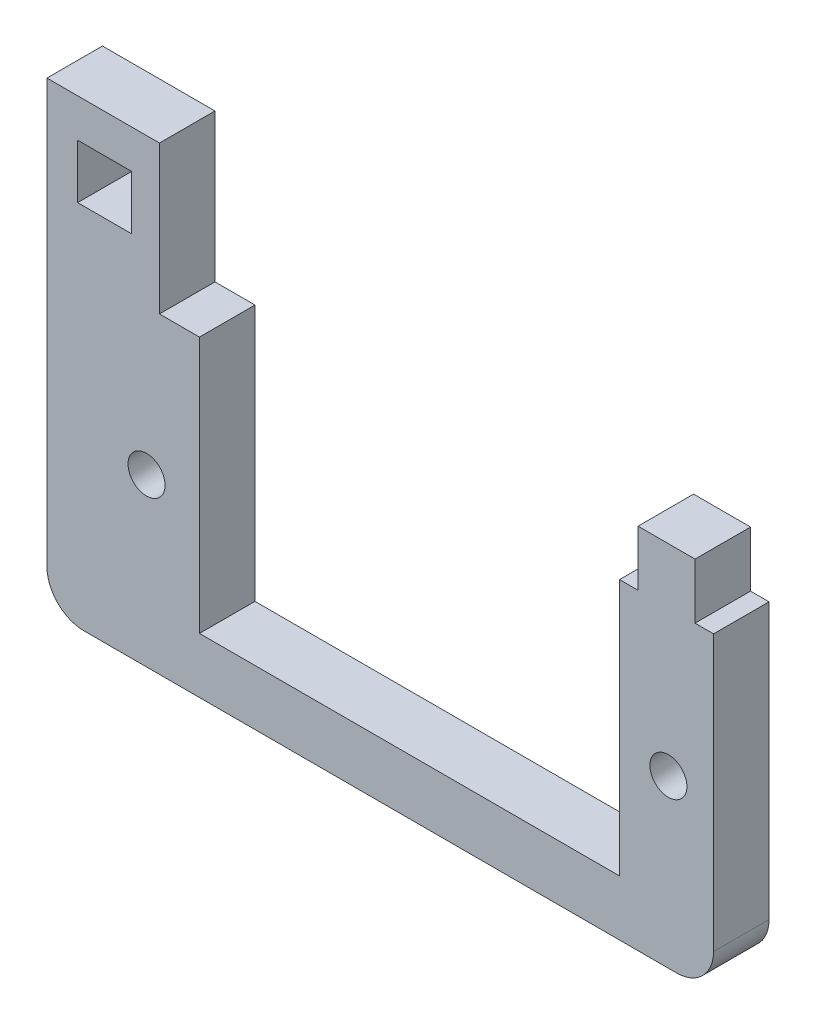
ISO-10303-21;
HEADER;
FILE_DESCRIPTION(('STEP AP214'),'2;1');
FILE_NAME('part.step','',(''),(''),'','','');
FILE_SCHEMA(('AUTOMOTIVE_DESIGN { 1 0 10303 214 1 1 1 1 }'));
ENDSEC;
DATA;
#1=APPLICATION_CONTEXT('core data for automotive mechanical design processes');
#2=APPLICATION_PROTOCOL_DEFINITION('international standard','automotive_design',2000,#1);
#3=PRODUCT_CONTEXT('',#1,'mechanical');
#4=PRODUCT('Part','Part','',(#3));
#5=PRODUCT_RELATED_PRODUCT_CATEGORY('part','',(#4));
#6=PRODUCT_DEFINITION_FORMATION('','',#4);
#7=PRODUCT_DEFINITION_CONTEXT('part definition',#1,'design');
#8=PRODUCT_DEFINITION('design','',#6,#7);
#9=PRODUCT_DEFINITION_SHAPE('','',#8);
#10=(LENGTH_UNIT() NAMED_UNIT(*) SI_UNIT(.MILLI.,.METRE.));
#11=(NAMED_UNIT(*) PLANE_ANGLE_UNIT() SI_UNIT($,.RADIAN.));
#12=(NAMED_UNIT(*) SI_UNIT($,.STERADIAN.) SOLID_ANGLE_UNIT());
#13=UNCERTAINTY_MEASURE_WITH_UNIT(LENGTH_MEASURE(1.E-05),#10,'distance_accuracy_value','');
#14=(GEOMETRIC_REPRESENTATION_CONTEXT(3) GLOBAL_UNCERTAINTY_ASSIGNED_CONTEXT((#13)) GLOBAL_UNIT_ASSIGNED_CONTEXT((#10,
#11,#12)) REPRESENTATION_CONTEXT('',''));
#15=CARTESIAN_POINT('',(0.,0.,0.));
#16=DIRECTION('',(0.,0.,1.));
#17=DIRECTION('',(1.,0.,0.));
#18=AXIS2_PLACEMENT_3D('',#15,#16,#17);
#19=CARTESIAN_POINT('',(0.,0.,3.));
#20=DIRECTION('',(0.,0.,-1.));
#21=DIRECTION('',(-1.,0.,0.));
#22=AXIS2_PLACEMENT_3D('',#19,#20,#21);
#23=PLANE('',#22);
#24=CARTESIAN_POINT('',(25.7454054054054,-2.51864864864865,3.));
#25=DIRECTION('',(0.,0.,1.));
#26=DIRECTION('',(1.,0.,0.));
#27=AXIS2_PLACEMENT_3D('',#24,#25,#26);
#28=CIRCLE('',#27,1.);
#29=CARTESIAN_POINT('',(26.7454054054054,-2.51864864864865,3.));
#30=VERTEX_POINT('',#29);
#31=EDGE_CURVE('E215',#30,#30,#28,.T.);
#32=ORIENTED_EDGE('',*,*,#31,.F.);
#33=EDGE_LOOP('',(#32));
#34=FACE_BOUND('',#33,.T.);
#35=CARTESIAN_POINT('',(-2.4545945945946,-2.51864864864865,3.));
#36=DIRECTION('',(0.,0.,1.));
#37=DIRECTION('',(1.,0.,0.));
#38=AXIS2_PLACEMENT_3D('',#35,#36,#37);
#39=CIRCLE('',#38,1.);
#40=CARTESIAN_POINT('',(-1.4545945945946,-2.51864864864865,3.));
#41=VERTEX_POINT('',#40);
#42=EDGE_CURVE('E221',#41,#41,#39,.T.);
#43=ORIENTED_EDGE('',*,*,#42,.F.);
#44=EDGE_LOOP('',(#43));
#45=FACE_BOUND('',#44,.T.);
#46=DIRECTION('',(0.,-1.,0.));
#47=VECTOR('',#46,1.);
#48=CARTESIAN_POINT('',(-7.83675675675677,-11.5186486486487,3.));
#49=LINE('',#48,#47);
#50=CARTESIAN_POINT('',(-7.83675675675677,13.3513513513513,3.));
#51=VERTEX_POINT('',#50);
#52=CARTESIAN_POINT('',(-7.83675675675677,-9.51864864864866,3.));
#53=VERTEX_POINT('',#52);
#54=EDGE_CURVE('E227',#51,#53,#49,.T.);
#55=ORIENTED_EDGE('',*,*,#54,.T.);
#56=CARTESIAN_POINT('',(-5.83675675675677,-9.51864864864866,3.));
#57=DIRECTION('',(0.,0.,-1.));
#58=DIRECTION('',(-1.,0.,0.));
#59=AXIS2_PLACEMENT_3D('',#56,#57,#58);
#60=CIRCLE('',#59,2.);
#61=CARTESIAN_POINT('',(-5.83675675675677,-11.5186486486487,3.));
#62=VERTEX_POINT('',#61);
#63=EDGE_CURVE('E41',#53,#62,#60,.F.);
#64=ORIENTED_EDGE('',*,*,#63,.T.);
#65=DIRECTION('',(1.,0.,0.));
#66=VECTOR('',#65,1.);
#67=CARTESIAN_POINT('',(28.1854054054054,-11.5186486486487,3.));
#68=LINE('',#67,#66);
#69=CARTESIAN_POINT('',(26.1854054054054,-11.5186486486487,3.));
#70=VERTEX_POINT('',#69);
#71=EDGE_CURVE('E229',#62,#70,#68,.T.);
#72=ORIENTED_EDGE('',*,*,#71,.T.);
#73=CARTESIAN_POINT('',(26.1854054054054,-9.51864864864865,3.));
#74=DIRECTION('',(0.,0.,-1.));
#75=DIRECTION('',(-1.,0.,0.));
#76=AXIS2_PLACEMENT_3D('',#73,#74,#75);
#77=CIRCLE('',#76,2.);
#78=CARTESIAN_POINT('',(28.1854054054054,-9.51864864864865,3.));
#79=VERTEX_POINT('',#78);
#80=EDGE_CURVE('E48',#70,#79,#77,.F.);
#81=ORIENTED_EDGE('',*,*,#80,.T.);
#82=DIRECTION('',(0.,1.,0.));
#83=VECTOR('',#82,1.);
#84=CARTESIAN_POINT('',(28.1854054054054,5.35135135135135,3.));
#85=LINE('',#84,#83);
#86=CARTESIAN_POINT('',(28.1854054054054,5.35135135135135,3.));
#87=VERTEX_POINT('',#86);
#88=EDGE_CURVE('E232',#79,#87,#85,.T.);
#89=ORIENTED_EDGE('',*,*,#88,.T.);
#90=DIRECTION('',(-1.,0.,0.));
#91=VECTOR('',#90,1.);
#92=CARTESIAN_POINT('',(27.1854054054054,5.35135135135135,3.));
#93=LINE('',#92,#91);
#94=CARTESIAN_POINT('',(27.1854054054054,5.35135135135135,3.));
#95=VERTEX_POINT('',#94);
#96=EDGE_CURVE('E234',#87,#95,#93,.T.);
#97=ORIENTED_EDGE('',*,*,#96,.T.);
#98=DIRECTION('',(0.,1.,0.));
#99=VECTOR('',#98,1.);
#100=CARTESIAN_POINT('',(27.1854054054054,8.35135135135135,3.));
#101=LINE('',#100,#99);
#102=CARTESIAN_POINT('',(27.1854054054054,8.35135135135135,3.));
#103=VERTEX_POINT('',#102);
#104=EDGE_CURVE('E236',#95,#103,#101,.T.);
#105=ORIENTED_EDGE('',*,*,#104,.T.);
#106=DIRECTION('',(-1.,0.,0.));
#107=VECTOR('',#106,1.);
#108=CARTESIAN_POINT('',(24.1054054054054,8.35135135135135,3.));
#109=LINE('',#108,#107);
#110=CARTESIAN_POINT('',(24.1054054054054,8.35135135135135,3.));
#111=VERTEX_POINT('',#110);
#112=EDGE_CURVE('E238',#103,#111,#109,.T.);
#113=ORIENTED_EDGE('',*,*,#112,.T.);
#114=DIRECTION('',(0.,-1.,0.));
#115=VECTOR('',#114,1.);
#116=CARTESIAN_POINT('',(24.1054054054054,5.35135135135135,3.));
#117=LINE('',#116,#115);
#118=CARTESIAN_POINT('',(24.1054054054054,5.35135135135135,3.));
#119=VERTEX_POINT('',#118);
#120=EDGE_CURVE('E240',#111,#119,#117,.T.);
#121=ORIENTED_EDGE('',*,*,#120,.T.);
#122=DIRECTION('',(-1.,0.,0.));
#123=VECTOR('',#122,1.);
#124=CARTESIAN_POINT('',(23.1054054054054,5.35135135135135,3.));
#125=LINE('',#124,#123);
#126=CARTESIAN_POINT('',(23.1054054054054,5.35135135135135,3.));
#127=VERTEX_POINT('',#126);
#128=EDGE_CURVE('E242',#119,#127,#125,.T.);
#129=ORIENTED_EDGE('',*,*,#128,.T.);
#130=DIRECTION('',(0.,-1.,0.));
#131=VECTOR('',#130,1.);
#132=CARTESIAN_POINT('',(23.1054054054054,-8.51864864864865,3.));
#133=LINE('',#132,#131);
#134=CARTESIAN_POINT('',(23.1054054054054,-8.51864864864865,3.));
#135=VERTEX_POINT('',#134);
#136=EDGE_CURVE('E244',#127,#135,#133,.T.);
#137=ORIENTED_EDGE('',*,*,#136,.T.);
#138=DIRECTION('',(-1.,0.,0.));
#139=VECTOR('',#138,1.);
#140=CARTESIAN_POINT('',(0.405405405405402,-8.51864864864865,3.));
#141=LINE('',#140,#139);
#142=CARTESIAN_POINT('',(0.405405405405402,-8.51864864864865,3.));
#143=VERTEX_POINT('',#142);
#144=EDGE_CURVE('E246',#135,#143,#141,.T.);
#145=ORIENTED_EDGE('',*,*,#144,.T.);
#146=DIRECTION('',(0.,1.,0.));
#147=VECTOR('',#146,1.);
#148=CARTESIAN_POINT('',(0.4054054054054,5.35135135135135,3.));
#149=LINE('',#148,#147);
#150=CARTESIAN_POINT('',(0.4054054054054,5.35135135135135,3.));
#151=VERTEX_POINT('',#150);
#152=EDGE_CURVE('E248',#143,#151,#149,.T.);
#153=ORIENTED_EDGE('',*,*,#152,.T.);
#154=DIRECTION('',(-1.,0.,0.));
#155=VECTOR('',#154,1.);
#156=CARTESIAN_POINT('',(-1.75675675675676,5.35135135135135,3.));
#157=LINE('',#156,#155);
#158=CARTESIAN_POINT('',(-1.75675675675676,5.35135135135135,3.));
#159=VERTEX_POINT('',#158);
#160=EDGE_CURVE('E250',#151,#159,#157,.T.);
#161=ORIENTED_EDGE('',*,*,#160,.T.);
#162=DIRECTION('',(0.,1.,0.));
#163=VECTOR('',#162,1.);
#164=CARTESIAN_POINT('',(-1.75675675675677,13.3513513513513,3.));
#165=LINE('',#164,#163);
#166=CARTESIAN_POINT('',(-1.75675675675677,13.3513513513513,3.));
#167=VERTEX_POINT('',#166);
#168=EDGE_CURVE('E252',#159,#167,#165,.T.);
#169=ORIENTED_EDGE('',*,*,#168,.T.);
#170=DIRECTION('',(-1.,0.,0.));
#171=VECTOR('',#170,1.);
#172=CARTESIAN_POINT('',(-7.83675675675677,13.3513513513513,3.));
#173=LINE('',#172,#171);
#174=EDGE_CURVE('E254',#167,#51,#173,.T.);
#175=ORIENTED_EDGE('',*,*,#174,.T.);
#176=EDGE_LOOP('',(#55,#64,#72,#81,#89,#97,#105,#113,#121,#129,#137,#145,#153,#161,#169,#175));
#177=FACE_BOUND('',#176,.T.);
#178=DIRECTION('',(0.,-1.,0.));
#179=VECTOR('',#178,1.);
#180=CARTESIAN_POINT('',(-6.17675675675677,11.2713513513513,3.));
#181=LINE('',#180,#179);
#182=CARTESIAN_POINT('',(-6.17675675675677,11.2713513513513,3.));
#183=VERTEX_POINT('',#182);
#184=CARTESIAN_POINT('',(-6.17675675675677,8.35135135135135,3.));
#185=VERTEX_POINT('',#184);
#186=EDGE_CURVE('E174',#183,#185,#181,.T.);
#187=ORIENTED_EDGE('',*,*,#186,.F.);
#188=DIRECTION('',(-1.,0.,0.));
#189=VECTOR('',#188,1.);
#190=CARTESIAN_POINT('',(-6.17675675675677,11.2713513513513,3.));
#191=LINE('',#190,#189);
#192=CARTESIAN_POINT('',(-3.25675675675677,11.2713513513513,3.));
#193=VERTEX_POINT('',#192);
#194=EDGE_CURVE('E199',#193,#183,#191,.T.);
#195=ORIENTED_EDGE('',*,*,#194,.F.);
#196=DIRECTION('',(0.,1.,0.));
#197=VECTOR('',#196,1.);
#198=CARTESIAN_POINT('',(-3.25675675675677,11.2713513513513,3.));
#199=LINE('',#198,#197);
#200=CARTESIAN_POINT('',(-3.25675675675677,8.35135135135135,3.));
#201=VERTEX_POINT('',#200);
#202=EDGE_CURVE('E197',#201,#193,#199,.T.);
#203=ORIENTED_EDGE('',*,*,#202,.F.);
#204=DIRECTION('',(1.,0.,0.));
#205=VECTOR('',#204,1.);
#206=CARTESIAN_POINT('',(-6.17675675675677,8.35135135135135,3.));
#207=LINE('',#206,#205);
#208=EDGE_CURVE('E184',#185,#201,#207,.T.);
#209=ORIENTED_EDGE('',*,*,#208,.F.);
#210=EDGE_LOOP('',(#187,#195,#203,#209));
#211=FACE_BOUND('',#210,.T.);
#212=ADVANCED_FACE('F33',(#34,#45,#177,#211),#23,.F.);
#213=CARTESIAN_POINT('',(0.,0.,0.));
#214=DIRECTION('',(0.,0.,-1.));
#215=DIRECTION('',(-1.,0.,0.));
#216=AXIS2_PLACEMENT_3D('',#213,#214,#215);
#217=PLANE('',#216);
#218=CARTESIAN_POINT('',(-2.4545945945946,-2.51864864864865,0.));
#219=DIRECTION('',(0.,0.,1.));
#220=DIRECTION('',(1.,0.,0.));
#221=AXIS2_PLACEMENT_3D('',#218,#219,#220);
#222=CIRCLE('',#221,1.);
#223=CARTESIAN_POINT('',(-1.4545945945946,-2.51864864864865,0.));
#224=VERTEX_POINT('',#223);
#225=EDGE_CURVE('E218',#224,#224,#222,.T.);
#226=ORIENTED_EDGE('',*,*,#225,.T.);
#227=EDGE_LOOP('',(#226));
#228=FACE_BOUND('',#227,.T.);
#229=DIRECTION('',(1.,0.,0.));
#230=VECTOR('',#229,1.);
#231=CARTESIAN_POINT('',(28.1854054054054,-11.5186486486487,0.));
#232=LINE('',#231,#230);
#233=CARTESIAN_POINT('',(-5.83675675675677,-11.5186486486487,0.));
#234=VERTEX_POINT('',#233);
#235=CARTESIAN_POINT('',(26.1854054054054,-11.5186486486487,0.));
#236=VERTEX_POINT('',#235);
#237=EDGE_CURVE('E258',#234,#236,#232,.T.);
#238=ORIENTED_EDGE('',*,*,#237,.F.);
#239=CARTESIAN_POINT('',(-5.83675675675677,-9.51864864864866,0.));
#240=DIRECTION('',(0.,0.,-1.));
#241=DIRECTION('',(-1.,0.,0.));
#242=AXIS2_PLACEMENT_3D('',#239,#240,#241);
#243=CIRCLE('',#242,2.);
#244=CARTESIAN_POINT('',(-7.83675675675677,-9.51864864864866,0.));
#245=VERTEX_POINT('',#244);
#246=EDGE_CURVE('E326',#234,#245,#243,.T.);
#247=ORIENTED_EDGE('',*,*,#246,.T.);
#248=DIRECTION('',(0.,-1.,0.));
#249=VECTOR('',#248,1.);
#250=CARTESIAN_POINT('',(-7.83675675675677,-11.5186486486487,0.));
#251=LINE('',#250,#249);
#252=CARTESIAN_POINT('',(-7.83675675675677,13.3513513513513,0.));
#253=VERTEX_POINT('',#252);
#254=EDGE_CURVE('E224',#253,#245,#251,.T.);
#255=ORIENTED_EDGE('',*,*,#254,.F.);
#256=DIRECTION('',(-1.,0.,0.));
#257=VECTOR('',#256,1.);
#258=CARTESIAN_POINT('',(-7.83675675675677,13.3513513513513,0.));
#259=LINE('',#258,#257);
#260=CARTESIAN_POINT('',(-1.75675675675677,13.3513513513513,0.));
#261=VERTEX_POINT('',#260);
#262=EDGE_CURVE('E230',#261,#253,#259,.T.);
#263=ORIENTED_EDGE('',*,*,#262,.F.);
#264=DIRECTION('',(0.,1.,0.));
#265=VECTOR('',#264,1.);
#266=CARTESIAN_POINT('',(-1.75675675675677,13.3513513513513,0.));
#267=LINE('',#266,#265);
#268=CARTESIAN_POINT('',(-1.75675675675676,5.35135135135135,0.));
#269=VERTEX_POINT('',#268);
#270=EDGE_CURVE('E281',#269,#261,#267,.T.);
#271=ORIENTED_EDGE('',*,*,#270,.F.);
#272=DIRECTION('',(-1.,0.,0.));
#273=VECTOR('',#272,1.);
#274=CARTESIAN_POINT('',(-1.75675675675676,5.35135135135135,0.));
#275=LINE('',#274,#273);
#276=CARTESIAN_POINT('',(0.4054054054054,5.35135135135135,0.));
#277=VERTEX_POINT('',#276);
#278=EDGE_CURVE('E279',#277,#269,#275,.T.);
#279=ORIENTED_EDGE('',*,*,#278,.F.);
#280=DIRECTION('',(0.,1.,0.));
#281=VECTOR('',#280,1.);
#282=CARTESIAN_POINT('',(0.4054054054054,5.35135135135135,0.));
#283=LINE('',#282,#281);
#284=CARTESIAN_POINT('',(0.405405405405402,-8.51864864864865,0.));
#285=VERTEX_POINT('',#284);
#286=EDGE_CURVE('E277',#285,#277,#283,.T.);
#287=ORIENTED_EDGE('',*,*,#286,.F.);
#288=DIRECTION('',(-1.,0.,0.));
#289=VECTOR('',#288,1.);
#290=CARTESIAN_POINT('',(0.405405405405402,-8.51864864864865,0.));
#291=LINE('',#290,#289);
#292=CARTESIAN_POINT('',(23.1054054054054,-8.51864864864865,0.));
#293=VERTEX_POINT('',#292);
#294=EDGE_CURVE('E275',#293,#285,#291,.T.);
#295=ORIENTED_EDGE('',*,*,#294,.F.);
#296=DIRECTION('',(0.,-1.,0.));
#297=VECTOR('',#296,1.);
#298=CARTESIAN_POINT('',(23.1054054054054,-8.51864864864865,0.));
#299=LINE('',#298,#297);
#300=CARTESIAN_POINT('',(23.1054054054054,5.35135135135135,0.));
#301=VERTEX_POINT('',#300);
#302=EDGE_CURVE('E273',#301,#293,#299,.T.);
#303=ORIENTED_EDGE('',*,*,#302,.F.);
#304=DIRECTION('',(-1.,0.,0.));
#305=VECTOR('',#304,1.);
#306=CARTESIAN_POINT('',(23.1054054054054,5.35135135135135,0.));
#307=LINE('',#306,#305);
#308=CARTESIAN_POINT('',(24.1054054054054,5.35135135135135,0.));
#309=VERTEX_POINT('',#308);
#310=EDGE_CURVE('E271',#309,#301,#307,.T.);
#311=ORIENTED_EDGE('',*,*,#310,.F.);
#312=DIRECTION('',(0.,-1.,0.));
#313=VECTOR('',#312,1.);
#314=CARTESIAN_POINT('',(24.1054054054054,5.35135135135135,0.));
#315=LINE('',#314,#313);
#316=CARTESIAN_POINT('',(24.1054054054054,8.35135135135135,0.));
#317=VERTEX_POINT('',#316);
#318=EDGE_CURVE('E269',#317,#309,#315,.T.);
#319=ORIENTED_EDGE('',*,*,#318,.F.);
#320=DIRECTION('',(-1.,0.,0.));
#321=VECTOR('',#320,1.);
#322=CARTESIAN_POINT('',(24.1054054054054,8.35135135135135,0.));
#323=LINE('',#322,#321);
#324=CARTESIAN_POINT('',(27.1854054054054,8.35135135135135,0.));
#325=VERTEX_POINT('',#324);
#326=EDGE_CURVE('E267',#325,#317,#323,.T.);
#327=ORIENTED_EDGE('',*,*,#326,.F.);
#328=DIRECTION('',(0.,1.,0.));
#329=VECTOR('',#328,1.);
#330=CARTESIAN_POINT('',(27.1854054054054,8.35135135135135,0.));
#331=LINE('',#330,#329);
#332=CARTESIAN_POINT('',(27.1854054054054,5.35135135135135,0.));
#333=VERTEX_POINT('',#332);
#334=EDGE_CURVE('E265',#333,#325,#331,.T.);
#335=ORIENTED_EDGE('',*,*,#334,.F.);
#336=DIRECTION('',(-1.,0.,0.));
#337=VECTOR('',#336,1.);
#338=CARTESIAN_POINT('',(27.1854054054054,5.35135135135135,0.));
#339=LINE('',#338,#337);
#340=CARTESIAN_POINT('',(28.1854054054054,5.35135135135135,0.));
#341=VERTEX_POINT('',#340);
#342=EDGE_CURVE('E263',#341,#333,#339,.T.);
#343=ORIENTED_EDGE('',*,*,#342,.F.);
#344=DIRECTION('',(0.,1.,0.));
#345=VECTOR('',#344,1.);
#346=CARTESIAN_POINT('',(28.1854054054054,5.35135135135135,0.));
#347=LINE('',#346,#345);
#348=CARTESIAN_POINT('',(28.1854054054054,-9.51864864864865,0.));
#349=VERTEX_POINT('',#348);
#350=EDGE_CURVE('E261',#349,#341,#347,.T.);
#351=ORIENTED_EDGE('',*,*,#350,.F.);
#352=CARTESIAN_POINT('',(26.1854054054054,-9.51864864864865,0.));
#353=DIRECTION('',(0.,0.,-1.));
#354=DIRECTION('',(-1.,0.,0.));
#355=AXIS2_PLACEMENT_3D('',#352,#353,#354);
#356=CIRCLE('',#355,2.);
#357=EDGE_CURVE('E324',#349,#236,#356,.T.);
#358=ORIENTED_EDGE('',*,*,#357,.T.);
#359=EDGE_LOOP('',(#238,#247,#255,#263,#271,#279,#287,#295,#303,#311,#319,#327,#335,#343,#351,#358));
#360=FACE_BOUND('',#359,.T.);
#361=CARTESIAN_POINT('',(25.7454054054054,-2.51864864864865,0.));
#362=DIRECTION('',(0.,0.,1.));
#363=DIRECTION('',(1.,0.,0.));
#364=AXIS2_PLACEMENT_3D('',#361,#362,#363);
#365=CIRCLE('',#364,1.);
#366=CARTESIAN_POINT('',(26.7454054054054,-2.51864864864865,0.));
#367=VERTEX_POINT('',#366);
#368=EDGE_CURVE('E192',#367,#367,#365,.T.);
#369=ORIENTED_EDGE('',*,*,#368,.T.);
#370=EDGE_LOOP('',(#369));
#371=FACE_BOUND('',#370,.T.);
#372=DIRECTION('',(-1.,0.,0.));
#373=VECTOR('',#372,1.);
#374=CARTESIAN_POINT('',(-6.17675675675677,11.2713513513513,0.));
#375=LINE('',#374,#373);
#376=CARTESIAN_POINT('',(-3.25675675675677,11.2713513513513,0.));
#377=VERTEX_POINT('',#376);
#378=CARTESIAN_POINT('',(-6.17675675675677,11.2713513513513,0.));
#379=VERTEX_POINT('',#378);
#380=EDGE_CURVE('E185',#377,#379,#375,.T.);
#381=ORIENTED_EDGE('',*,*,#380,.T.);
#382=DIRECTION('',(0.,-1.,0.));
#383=VECTOR('',#382,1.);
#384=CARTESIAN_POINT('',(-6.17675675675677,11.2713513513513,0.));
#385=LINE('',#384,#383);
#386=CARTESIAN_POINT('',(-6.17675675675677,8.35135135135135,0.));
#387=VERTEX_POINT('',#386);
#388=EDGE_CURVE('E203',#379,#387,#385,.T.);
#389=ORIENTED_EDGE('',*,*,#388,.T.);
#390=DIRECTION('',(1.,0.,0.));
#391=VECTOR('',#390,1.);
#392=CARTESIAN_POINT('',(-6.17675675675677,8.35135135135135,0.));
#393=LINE('',#392,#391);
#394=CARTESIAN_POINT('',(-3.25675675675677,8.35135135135135,0.));
#395=VERTEX_POINT('',#394);
#396=EDGE_CURVE('E191',#387,#395,#393,.T.);
#397=ORIENTED_EDGE('',*,*,#396,.T.);
#398=DIRECTION('',(0.,1.,0.));
#399=VECTOR('',#398,1.);
#400=CARTESIAN_POINT('',(-3.25675675675677,11.2713513513513,0.));
#401=LINE('',#400,#399);
#402=EDGE_CURVE('E206',#395,#377,#401,.T.);
#403=ORIENTED_EDGE('',*,*,#402,.T.);
#404=EDGE_LOOP('',(#381,#389,#397,#403));
#405=FACE_BOUND('',#404,.T.);
#406=ADVANCED_FACE('F340',(#228,#360,#371,#405),#217,.T.);
#407=CARTESIAN_POINT('',(-7.83675675675677,-11.5186486486487,3.));
#408=DIRECTION('',(1.,0.,0.));
#409=DIRECTION('',(0.,1.,0.));
#410=AXIS2_PLACEMENT_3D('',#407,#408,#409);
#411=PLANE('',#410);
#412=ORIENTED_EDGE('',*,*,#254,.T.);
#413=DIRECTION('',(0.,0.,-1.));
#414=VECTOR('',#413,1.);
#415=CARTESIAN_POINT('',(-7.83675675675677,-9.51864864864866,3.));
#416=LINE('',#415,#414);
#417=EDGE_CURVE('E56',#245,#53,#416,.F.);
#418=ORIENTED_EDGE('',*,*,#417,.T.);
#419=ORIENTED_EDGE('',*,*,#54,.F.);
#420=DIRECTION('',(0.,0.,-1.));
#421=VECTOR('',#420,1.);
#422=CARTESIAN_POINT('',(-7.83675675675677,13.3513513513513,3.));
#423=LINE('',#422,#421);
#424=EDGE_CURVE('E256',#51,#253,#423,.T.);
#425=ORIENTED_EDGE('',*,*,#424,.T.);
#426=EDGE_LOOP('',(#412,#418,#419,#425));
#427=FACE_BOUND('',#426,.T.);
#428=ADVANCED_FACE('F343',(#427),#411,.F.);
#429=CARTESIAN_POINT('',(28.1854054054054,-11.5186486486487,3.));
#430=DIRECTION('',(0.,1.,0.));
#431=DIRECTION('',(-1.,0.,0.));
#432=AXIS2_PLACEMENT_3D('',#429,#430,#431);
#433=PLANE('',#432);
#434=ORIENTED_EDGE('',*,*,#71,.F.);
#435=DIRECTION('',(0.,0.,-1.));
#436=VECTOR('',#435,1.);
#437=CARTESIAN_POINT('',(-5.83675675675677,-11.5186486486487,3.));
#438=LINE('',#437,#436);
#439=EDGE_CURVE('E321',#62,#234,#438,.T.);
#440=ORIENTED_EDGE('',*,*,#439,.T.);
#441=ORIENTED_EDGE('',*,*,#237,.T.);
#442=DIRECTION('',(0.,0.,-1.));
#443=VECTOR('',#442,1.);
#444=CARTESIAN_POINT('',(26.1854054054054,-11.5186486486487,3.));
#445=LINE('',#444,#443);
#446=EDGE_CURVE('E319',#236,#70,#445,.F.);
#447=ORIENTED_EDGE('',*,*,#446,.T.);
#448=EDGE_LOOP('',(#434,#440,#441,#447));
#449=FACE_BOUND('',#448,.T.);
#450=ADVANCED_FACE('F334',(#449),#433,.F.);
#451=CARTESIAN_POINT('',(28.1854054054054,5.35135135135135,3.));
#452=DIRECTION('',(-1.,0.,0.));
#453=DIRECTION('',(0.,0.,1.));
#454=AXIS2_PLACEMENT_3D('',#451,#452,#453);
#455=PLANE('',#454);
#456=ORIENTED_EDGE('',*,*,#88,.F.);
#457=DIRECTION('',(0.,0.,-1.));
#458=VECTOR('',#457,1.);
#459=CARTESIAN_POINT('',(28.1854054054054,-9.51864864864865,3.));
#460=LINE('',#459,#458);
#461=EDGE_CURVE('E11',#79,#349,#460,.T.);
#462=ORIENTED_EDGE('',*,*,#461,.T.);
#463=ORIENTED_EDGE('',*,*,#350,.T.);
#464=DIRECTION('',(0.,0.,-1.));
#465=VECTOR('',#464,1.);
#466=CARTESIAN_POINT('',(28.1854054054054,5.35135135135135,3.));
#467=LINE('',#466,#465);
#468=EDGE_CURVE('E316',#87,#341,#467,.T.);
#469=ORIENTED_EDGE('',*,*,#468,.F.);
#470=EDGE_LOOP('',(#456,#462,#463,#469));
#471=FACE_BOUND('',#470,.T.);
#472=ADVANCED_FACE('F401',(#471),#455,.F.);
#473=CARTESIAN_POINT('',(27.1854054054054,5.35135135135135,3.));
#474=DIRECTION('',(0.,-1.,0.));
#475=DIRECTION('',(1.,0.,0.));
#476=AXIS2_PLACEMENT_3D('',#473,#474,#475);
#477=PLANE('',#476);
#478=ORIENTED_EDGE('',*,*,#342,.T.);
#479=DIRECTION('',(0.,0.,-1.));
#480=VECTOR('',#479,1.);
#481=CARTESIAN_POINT('',(27.1854054054054,5.35135135135135,3.));
#482=LINE('',#481,#480);
#483=EDGE_CURVE('E313',#95,#333,#482,.T.);
#484=ORIENTED_EDGE('',*,*,#483,.F.);
#485=ORIENTED_EDGE('',*,*,#96,.F.);
#486=ORIENTED_EDGE('',*,*,#468,.T.);
#487=EDGE_LOOP('',(#478,#484,#485,#486));
#488=FACE_BOUND('',#487,.T.);
#489=ADVANCED_FACE('F397',(#488),#477,.F.);
#490=CARTESIAN_POINT('',(27.1854054054054,8.35135135135135,3.));
#491=DIRECTION('',(-1.,0.,0.));
#492=DIRECTION('',(0.,0.,1.));
#493=AXIS2_PLACEMENT_3D('',#490,#491,#492);
#494=PLANE('',#493);
#495=ORIENTED_EDGE('',*,*,#334,.T.);
#496=DIRECTION('',(0.,0.,-1.));
#497=VECTOR('',#496,1.);
#498=CARTESIAN_POINT('',(27.1854054054054,8.35135135135135,3.));
#499=LINE('',#498,#497);
#500=EDGE_CURVE('E310',#103,#325,#499,.T.);
#501=ORIENTED_EDGE('',*,*,#500,.F.);
#502=ORIENTED_EDGE('',*,*,#104,.F.);
#503=ORIENTED_EDGE('',*,*,#483,.T.);
#504=EDGE_LOOP('',(#495,#501,#502,#503));
#505=FACE_BOUND('',#504,.T.);
#506=ADVANCED_FACE('F392',(#505),#494,.F.);
#507=CARTESIAN_POINT('',(24.1054054054054,8.35135135135135,3.));
#508=DIRECTION('',(0.,-1.,0.));
#509=DIRECTION('',(0.,0.,-1.));
#510=AXIS2_PLACEMENT_3D('',#507,#508,#509);
#511=PLANE('',#510);
#512=ORIENTED_EDGE('',*,*,#326,.T.);
#513=DIRECTION('',(0.,0.,-1.));
#514=VECTOR('',#513,1.);
#515=CARTESIAN_POINT('',(24.1054054054054,8.35135135135135,3.));
#516=LINE('',#515,#514);
#517=EDGE_CURVE('E307',#111,#317,#516,.T.);
#518=ORIENTED_EDGE('',*,*,#517,.F.);
#519=ORIENTED_EDGE('',*,*,#112,.F.);
#520=ORIENTED_EDGE('',*,*,#500,.T.);
#521=EDGE_LOOP('',(#512,#518,#519,#520));
#522=FACE_BOUND('',#521,.T.);
#523=ADVANCED_FACE('F388',(#522),#511,.F.);
#524=CARTESIAN_POINT('',(24.1054054054054,5.35135135135135,3.));
#525=DIRECTION('',(1.,0.,0.));
#526=DIRECTION('',(0.,0.,-1.));
#527=AXIS2_PLACEMENT_3D('',#524,#525,#526);
#528=PLANE('',#527);
#529=ORIENTED_EDGE('',*,*,#318,.T.);
#530=DIRECTION('',(0.,0.,-1.));
#531=VECTOR('',#530,1.);
#532=CARTESIAN_POINT('',(24.1054054054054,5.35135135135135,3.));
#533=LINE('',#532,#531);
#534=EDGE_CURVE('E304',#119,#309,#533,.T.);
#535=ORIENTED_EDGE('',*,*,#534,.F.);
#536=ORIENTED_EDGE('',*,*,#120,.F.);
#537=ORIENTED_EDGE('',*,*,#517,.T.);
#538=EDGE_LOOP('',(#529,#535,#536,#537));
#539=FACE_BOUND('',#538,.T.);
#540=ADVANCED_FACE('F383',(#539),#528,.F.);
#541=CARTESIAN_POINT('',(23.1054054054054,5.35135135135135,3.));
#542=DIRECTION('',(0.,-1.,0.));
#543=DIRECTION('',(0.,0.,-1.));
#544=AXIS2_PLACEMENT_3D('',#541,#542,#543);
#545=PLANE('',#544);
#546=ORIENTED_EDGE('',*,*,#310,.T.);
#547=DIRECTION('',(0.,0.,-1.));
#548=VECTOR('',#547,1.);
#549=CARTESIAN_POINT('',(23.1054054054054,5.35135135135135,3.));
#550=LINE('',#549,#548);
#551=EDGE_CURVE('E301',#127,#301,#550,.T.);
#552=ORIENTED_EDGE('',*,*,#551,.F.);
#553=ORIENTED_EDGE('',*,*,#128,.F.);
#554=ORIENTED_EDGE('',*,*,#534,.T.);
#555=EDGE_LOOP('',(#546,#552,#553,#554));
#556=FACE_BOUND('',#555,.T.);
#557=ADVANCED_FACE('F377',(#556),#545,.F.);
#558=CARTESIAN_POINT('',(23.1054054054054,-8.51864864864865,3.));
#559=DIRECTION('',(1.,0.,0.));
#560=DIRECTION('',(0.,0.,-1.));
#561=AXIS2_PLACEMENT_3D('',#558,#559,#560);
#562=PLANE('',#561);
#563=ORIENTED_EDGE('',*,*,#302,.T.);
#564=DIRECTION('',(0.,0.,-1.));
#565=VECTOR('',#564,1.);
#566=CARTESIAN_POINT('',(23.1054054054054,-8.51864864864865,3.));
#567=LINE('',#566,#565);
#568=EDGE_CURVE('E298',#135,#293,#567,.T.);
#569=ORIENTED_EDGE('',*,*,#568,.F.);
#570=ORIENTED_EDGE('',*,*,#136,.F.);
#571=ORIENTED_EDGE('',*,*,#551,.T.);
#572=EDGE_LOOP('',(#563,#569,#570,#571));
#573=FACE_BOUND('',#572,.T.);
#574=ADVANCED_FACE('F373',(#573),#562,.F.);
#575=CARTESIAN_POINT('',(0.405405405405402,-8.51864864864865,3.));
#576=DIRECTION('',(0.,-1.,0.));
#577=DIRECTION('',(0.,0.,-1.));
#578=AXIS2_PLACEMENT_3D('',#575,#576,#577);
#579=PLANE('',#578);
#580=ORIENTED_EDGE('',*,*,#294,.T.);
#581=DIRECTION('',(0.,0.,-1.));
#582=VECTOR('',#581,1.);
#583=CARTESIAN_POINT('',(0.405405405405402,-8.51864864864865,3.));
#584=LINE('',#583,#582);
#585=EDGE_CURVE('E295',#143,#285,#584,.T.);
#586=ORIENTED_EDGE('',*,*,#585,.F.);
#587=ORIENTED_EDGE('',*,*,#144,.F.);
#588=ORIENTED_EDGE('',*,*,#568,.T.);
#589=EDGE_LOOP('',(#580,#586,#587,#588));
#590=FACE_BOUND('',#589,.T.);
#591=ADVANCED_FACE('F368',(#590),#579,.F.);
#592=CARTESIAN_POINT('',(0.4054054054054,5.35135135135135,3.));
#593=DIRECTION('',(-1.,0.,0.));
#594=DIRECTION('',(0.,-1.,0.));
#595=AXIS2_PLACEMENT_3D('',#592,#593,#594);
#596=PLANE('',#595);
#597=ORIENTED_EDGE('',*,*,#286,.T.);
#598=DIRECTION('',(0.,0.,-1.));
#599=VECTOR('',#598,1.);
#600=CARTESIAN_POINT('',(0.4054054054054,5.35135135135135,3.));
#601=LINE('',#600,#599);
#602=EDGE_CURVE('E292',#151,#277,#601,.T.);
#603=ORIENTED_EDGE('',*,*,#602,.F.);
#604=ORIENTED_EDGE('',*,*,#152,.F.);
#605=ORIENTED_EDGE('',*,*,#585,.T.);
#606=EDGE_LOOP('',(#597,#603,#604,#605));
#607=FACE_BOUND('',#606,.T.);
#608=ADVANCED_FACE('F362',(#607),#596,.F.);
#609=CARTESIAN_POINT('',(-1.75675675675676,5.35135135135135,3.));
#610=DIRECTION('',(0.,-1.,0.));
#611=DIRECTION('',(0.,0.,-1.));
#612=AXIS2_PLACEMENT_3D('',#609,#610,#611);
#613=PLANE('',#612);
#614=ORIENTED_EDGE('',*,*,#278,.T.);
#615=DIRECTION('',(0.,0.,-1.));
#616=VECTOR('',#615,1.);
#617=CARTESIAN_POINT('',(-1.75675675675676,5.35135135135135,3.));
#618=LINE('',#617,#616);
#619=EDGE_CURVE('E289',#159,#269,#618,.T.);
#620=ORIENTED_EDGE('',*,*,#619,.F.);
#621=ORIENTED_EDGE('',*,*,#160,.F.);
#622=ORIENTED_EDGE('',*,*,#602,.T.);
#623=EDGE_LOOP('',(#614,#620,#621,#622));
#624=FACE_BOUND('',#623,.T.);
#625=ADVANCED_FACE('F358',(#624),#613,.F.);
#626=CARTESIAN_POINT('',(-1.75675675675677,13.3513513513513,3.));
#627=DIRECTION('',(-1.,0.,0.));
#628=DIRECTION('',(0.,-1.,0.));
#629=AXIS2_PLACEMENT_3D('',#626,#627,#628);
#630=PLANE('',#629);
#631=ORIENTED_EDGE('',*,*,#270,.T.);
#632=DIRECTION('',(0.,0.,-1.));
#633=VECTOR('',#632,1.);
#634=CARTESIAN_POINT('',(-1.75675675675677,13.3513513513513,3.));
#635=LINE('',#634,#633);
#636=EDGE_CURVE('E286',#167,#261,#635,.T.);
#637=ORIENTED_EDGE('',*,*,#636,.F.);
#638=ORIENTED_EDGE('',*,*,#168,.F.);
#639=ORIENTED_EDGE('',*,*,#619,.T.);
#640=EDGE_LOOP('',(#631,#637,#638,#639));
#641=FACE_BOUND('',#640,.T.);
#642=ADVANCED_FACE('F353',(#641),#630,.F.);
#643=CARTESIAN_POINT('',(-7.83675675675677,13.3513513513513,3.));
#644=DIRECTION('',(0.,-1.,0.));
#645=DIRECTION('',(0.,0.,-1.));
#646=AXIS2_PLACEMENT_3D('',#643,#644,#645);
#647=PLANE('',#646);
#648=ORIENTED_EDGE('',*,*,#262,.T.);
#649=ORIENTED_EDGE('',*,*,#424,.F.);
#650=ORIENTED_EDGE('',*,*,#174,.F.);
#651=ORIENTED_EDGE('',*,*,#636,.T.);
#652=EDGE_LOOP('',(#648,#649,#650,#651));
#653=FACE_BOUND('',#652,.T.);
#654=ADVANCED_FACE('F347',(#653),#647,.F.);
#655=CARTESIAN_POINT('',(-2.4545945945946,-2.51864864864865,3.));
#656=DIRECTION('',(0.,0.,-1.));
#657=DIRECTION('',(-1.,0.,0.));
#658=AXIS2_PLACEMENT_3D('',#655,#656,#657);
#659=CYLINDRICAL_SURFACE('',#658,1.);
#660=ORIENTED_EDGE('',*,*,#42,.T.);
#661=EDGE_LOOP('',(#660));
#662=FACE_BOUND('',#661,.T.);
#663=ORIENTED_EDGE('',*,*,#225,.F.);
#664=EDGE_LOOP('',(#663));
#665=FACE_BOUND('',#664,.T.);
#666=ADVANCED_FACE('F420',(#662,#665),#659,.F.);
#667=CARTESIAN_POINT('',(25.7454054054054,-2.51864864864865,3.));
#668=DIRECTION('',(0.,0.,-1.));
#669=DIRECTION('',(-1.,0.,0.));
#670=AXIS2_PLACEMENT_3D('',#667,#668,#669);
#671=CYLINDRICAL_SURFACE('',#670,1.);
#672=ORIENTED_EDGE('',*,*,#31,.T.);
#673=EDGE_LOOP('',(#672));
#674=FACE_BOUND('',#673,.T.);
#675=ORIENTED_EDGE('',*,*,#368,.F.);
#676=EDGE_LOOP('',(#675));
#677=FACE_BOUND('',#676,.T.);
#678=ADVANCED_FACE('F513',(#674,#677),#671,.F.);
#679=CARTESIAN_POINT('',(-6.17675675675677,11.2713513513513,3.));
#680=DIRECTION('',(1.,0.,0.));
#681=DIRECTION('',(0.,1.,0.));
#682=AXIS2_PLACEMENT_3D('',#679,#680,#681);
#683=PLANE('',#682);
#684=ORIENTED_EDGE('',*,*,#388,.F.);
#685=DIRECTION('',(0.,0.,-1.));
#686=VECTOR('',#685,1.);
#687=CARTESIAN_POINT('',(-6.17675675675677,11.2713513513513,3.));
#688=LINE('',#687,#686);
#689=EDGE_CURVE('E180',#183,#379,#688,.T.);
#690=ORIENTED_EDGE('',*,*,#689,.F.);
#691=ORIENTED_EDGE('',*,*,#186,.T.);
#692=DIRECTION('',(0.,0.,-1.));
#693=VECTOR('',#692,1.);
#694=CARTESIAN_POINT('',(-6.17675675675677,8.35135135135135,3.));
#695=LINE('',#694,#693);
#696=EDGE_CURVE('E177',#185,#387,#695,.T.);
#697=ORIENTED_EDGE('',*,*,#696,.T.);
#698=EDGE_LOOP('',(#684,#690,#691,#697));
#699=FACE_BOUND('',#698,.T.);
#700=ADVANCED_FACE('F176',(#699),#683,.T.);
#701=CARTESIAN_POINT('',(-6.17675675675677,8.35135135135135,3.));
#702=DIRECTION('',(0.,1.,0.));
#703=DIRECTION('',(0.,0.,1.));
#704=AXIS2_PLACEMENT_3D('',#701,#702,#703);
#705=PLANE('',#704);
#706=ORIENTED_EDGE('',*,*,#396,.F.);
#707=ORIENTED_EDGE('',*,*,#696,.F.);
#708=ORIENTED_EDGE('',*,*,#208,.T.);
#709=DIRECTION('',(0.,0.,-1.));
#710=VECTOR('',#709,1.);
#711=CARTESIAN_POINT('',(-3.25675675675677,8.35135135135135,3.));
#712=LINE('',#711,#710);
#713=EDGE_CURVE('E193',#201,#395,#712,.T.);
#714=ORIENTED_EDGE('',*,*,#713,.T.);
#715=EDGE_LOOP('',(#706,#707,#708,#714));
#716=FACE_BOUND('',#715,.T.);
#717=ADVANCED_FACE('F188',(#716),#705,.T.);
#718=CARTESIAN_POINT('',(-3.25675675675677,11.2713513513513,3.));
#719=DIRECTION('',(-1.,0.,0.));
#720=DIRECTION('',(0.,-1.,0.));
#721=AXIS2_PLACEMENT_3D('',#718,#719,#720);
#722=PLANE('',#721);
#723=ORIENTED_EDGE('',*,*,#402,.F.);
#724=ORIENTED_EDGE('',*,*,#713,.F.);
#725=ORIENTED_EDGE('',*,*,#202,.T.);
#726=DIRECTION('',(0.,0.,-1.));
#727=VECTOR('',#726,1.);
#728=CARTESIAN_POINT('',(-3.25675675675677,11.2713513513513,3.));
#729=LINE('',#728,#727);
#730=EDGE_CURVE('E212',#193,#377,#729,.T.);
#731=ORIENTED_EDGE('',*,*,#730,.T.);
#732=EDGE_LOOP('',(#723,#724,#725,#731));
#733=FACE_BOUND('',#732,.T.);
#734=ADVANCED_FACE('F532',(#733),#722,.T.);
#735=CARTESIAN_POINT('',(-6.17675675675677,11.2713513513513,3.));
#736=DIRECTION('',(0.,-1.,0.));
#737=DIRECTION('',(0.,0.,-1.));
#738=AXIS2_PLACEMENT_3D('',#735,#736,#737);
#739=PLANE('',#738);
#740=ORIENTED_EDGE('',*,*,#380,.F.);
#741=ORIENTED_EDGE('',*,*,#730,.F.);
#742=ORIENTED_EDGE('',*,*,#194,.T.);
#743=ORIENTED_EDGE('',*,*,#689,.T.);
#744=EDGE_LOOP('',(#740,#741,#742,#743));
#745=FACE_BOUND('',#744,.T.);
#746=ADVANCED_FACE('F408',(#745),#739,.T.);
#747=CARTESIAN_POINT('',(-5.83675675675677,-9.51864864864866,3.));
#748=DIRECTION('',(0.,0.,-1.));
#749=DIRECTION('',(-1.,0.,0.));
#750=AXIS2_PLACEMENT_3D('',#747,#748,#749);
#751=CYLINDRICAL_SURFACE('',#750,2.);
#752=ORIENTED_EDGE('',*,*,#63,.F.);
#753=ORIENTED_EDGE('',*,*,#417,.F.);
#754=ORIENTED_EDGE('',*,*,#246,.F.);
#755=ORIENTED_EDGE('',*,*,#439,.F.);
#756=EDGE_LOOP('',(#752,#753,#754,#755));
#757=FACE_BOUND('',#756,.T.);
#758=ADVANCED_FACE('F337',(#757),#751,.T.);
#759=CARTESIAN_POINT('',(26.1854054054054,-9.51864864864865,3.));
#760=DIRECTION('',(0.,0.,-1.));
#761=DIRECTION('',(-1.,0.,0.));
#762=AXIS2_PLACEMENT_3D('',#759,#760,#761);
#763=CYLINDRICAL_SURFACE('',#762,2.);
#764=ORIENTED_EDGE('',*,*,#80,.F.);
#765=ORIENTED_EDGE('',*,*,#446,.F.);
#766=ORIENTED_EDGE('',*,*,#357,.F.);
#767=ORIENTED_EDGE('',*,*,#461,.F.);
#768=EDGE_LOOP('',(#764,#765,#766,#767));
#769=FACE_BOUND('',#768,.T.);
#770=ADVANCED_FACE('F35',(#769),#763,.T.);
#771=CLOSED_SHELL('',(#212,#406,#428,#450,#472,#489,#506,#523,#540,#557,#574,#591,#608,#625,
#642,#654,#666,#678,#700,#717,#734,#746,#758,#770));
#772=MANIFOLD_SOLID_BREP('B2',#771);
#773=ADVANCED_BREP_SHAPE_REPRESENTATION('',(#18,#772),#14);
#774=SHAPE_DEFINITION_REPRESENTATION(#9,#773);
ENDSEC;
END-ISO-10303-21;
